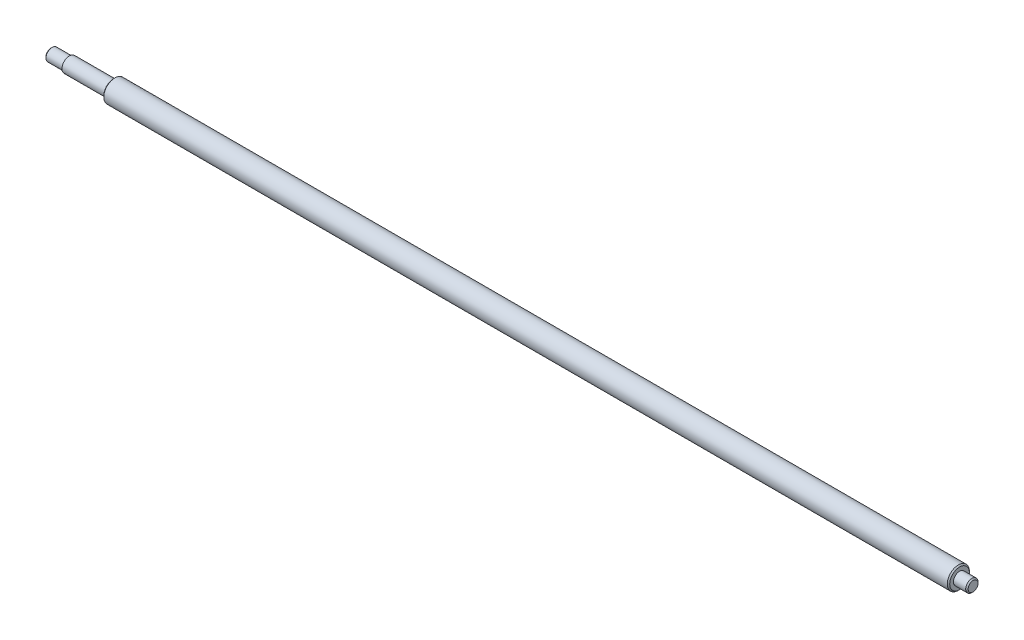
ISO-10303-21;
HEADER;
FILE_DESCRIPTION(('STEP AP214'),'2;1');
FILE_NAME('part.step','',(''),(''),'','','');
FILE_SCHEMA(('AUTOMOTIVE_DESIGN { 1 0 10303 214 1 1 1 1 }'));
ENDSEC;
DATA;
#1=APPLICATION_CONTEXT('core data for automotive mechanical design processes');
#2=APPLICATION_PROTOCOL_DEFINITION('international standard','automotive_design',2000,#1);
#3=PRODUCT_CONTEXT('',#1,'mechanical');
#4=PRODUCT('Part','Part','',(#3));
#5=PRODUCT_RELATED_PRODUCT_CATEGORY('part','',(#4));
#6=PRODUCT_DEFINITION_FORMATION('','',#4);
#7=PRODUCT_DEFINITION_CONTEXT('part definition',#1,'design');
#8=PRODUCT_DEFINITION('design','',#6,#7);
#9=PRODUCT_DEFINITION_SHAPE('','',#8);
#10=(LENGTH_UNIT() NAMED_UNIT(*) SI_UNIT(.MILLI.,.METRE.));
#11=(NAMED_UNIT(*) PLANE_ANGLE_UNIT() SI_UNIT($,.RADIAN.));
#12=(NAMED_UNIT(*) SI_UNIT($,.STERADIAN.) SOLID_ANGLE_UNIT());
#13=UNCERTAINTY_MEASURE_WITH_UNIT(LENGTH_MEASURE(1.E-05),#10,'distance_accuracy_value','');
#14=(GEOMETRIC_REPRESENTATION_CONTEXT(3) GLOBAL_UNCERTAINTY_ASSIGNED_CONTEXT((#13)) GLOBAL_UNIT_ASSIGNED_CONTEXT((#10,
#11,#12)) REPRESENTATION_CONTEXT('',''));
#15=CARTESIAN_POINT('',(0.,0.,0.));
#16=DIRECTION('',(0.,0.,1.));
#17=DIRECTION('',(1.,0.,0.));
#18=AXIS2_PLACEMENT_3D('',#15,#16,#17);
#19=CARTESIAN_POINT('',(-208.466913464529,0.,0.));
#20=DIRECTION('',(1.,0.,0.));
#21=DIRECTION('',(0.,0.,-1.));
#22=AXIS2_PLACEMENT_3D('',#19,#20,#21);
#23=PLANE('',#22);
#24=CARTESIAN_POINT('',(-208.466913464529,0.,0.));
#25=DIRECTION('',(-1.,0.,0.));
#26=DIRECTION('',(0.,0.,1.));
#27=AXIS2_PLACEMENT_3D('',#24,#25,#26);
#28=CIRCLE('',#27,4.);
#29=CARTESIAN_POINT('',(-208.466913464529,0.,4.));
#30=VERTEX_POINT('',#29);
#31=EDGE_CURVE('E10',#30,#30,#28,.T.);
#32=ORIENTED_EDGE('',*,*,#31,.T.);
#33=EDGE_LOOP('',(#32));
#34=FACE_BOUND('',#33,.T.);
#35=ADVANCED_FACE('F30',(#34),#23,.F.);
#36=CARTESIAN_POINT('',(-207.466913464529,0.,0.));
#37=DIRECTION('',(1.,0.,0.));
#38=DIRECTION('',(0.,0.,-1.));
#39=AXIS2_PLACEMENT_3D('',#36,#37,#38);
#40=CONICAL_SURFACE('',#39,5.,0.785398163397448);
#41=ORIENTED_EDGE('',*,*,#31,.F.);
#42=EDGE_LOOP('',(#41));
#43=FACE_BOUND('',#42,.T.);
#44=CARTESIAN_POINT('',(-207.466913464529,0.,0.));
#45=DIRECTION('',(-1.,0.,0.));
#46=DIRECTION('',(0.,0.,1.));
#47=AXIS2_PLACEMENT_3D('',#44,#45,#46);
#48=CIRCLE('',#47,5.);
#49=CARTESIAN_POINT('',(-207.466913464529,0.,5.));
#50=VERTEX_POINT('',#49);
#51=EDGE_CURVE('E36',#50,#50,#48,.T.);
#52=ORIENTED_EDGE('',*,*,#51,.T.);
#53=EDGE_LOOP('',(#52));
#54=FACE_BOUND('',#53,.T.);
#55=ADVANCED_FACE('F86',(#43,#54),#40,.T.);
#56=CARTESIAN_POINT('',(-222.964145739585,0.,0.));
#57=DIRECTION('',(-1.,0.,0.));
#58=DIRECTION('',(0.,0.,1.));
#59=AXIS2_PLACEMENT_3D('',#56,#57,#58);
#60=CYLINDRICAL_SURFACE('',#59,5.);
#61=ORIENTED_EDGE('',*,*,#51,.F.);
#62=EDGE_LOOP('',(#61));
#63=FACE_BOUND('',#62,.T.);
#64=CARTESIAN_POINT('',(-193.466913464529,0.,0.));
#65=DIRECTION('',(-1.,0.,0.));
#66=DIRECTION('',(0.,0.,1.));
#67=AXIS2_PLACEMENT_3D('',#64,#65,#66);
#68=CIRCLE('',#67,5.);
#69=CARTESIAN_POINT('',(-193.466913464529,0.,5.));
#70=VERTEX_POINT('',#69);
#71=EDGE_CURVE('E40',#70,#70,#68,.T.);
#72=ORIENTED_EDGE('',*,*,#71,.T.);
#73=EDGE_LOOP('',(#72));
#74=FACE_BOUND('',#73,.T.);
#75=ADVANCED_FACE('F90',(#63,#74),#60,.T.);
#76=CARTESIAN_POINT('',(-193.466913464529,0.,-5.));
#77=DIRECTION('',(1.,0.,0.));
#78=DIRECTION('',(0.,0.,-1.));
#79=AXIS2_PLACEMENT_3D('',#76,#77,#78);
#80=PLANE('',#79);
#81=ORIENTED_EDGE('',*,*,#71,.F.);
#82=EDGE_LOOP('',(#81));
#83=FACE_BOUND('',#82,.T.);
#84=CARTESIAN_POINT('',(-193.466913464529,0.,0.));
#85=DIRECTION('',(-1.,0.,0.));
#86=DIRECTION('',(0.,0.,1.));
#87=AXIS2_PLACEMENT_3D('',#84,#85,#86);
#88=CIRCLE('',#87,6.);
#89=CARTESIAN_POINT('',(-193.466913464529,0.,6.));
#90=VERTEX_POINT('',#89);
#91=EDGE_CURVE('E44',#90,#90,#88,.T.);
#92=ORIENTED_EDGE('',*,*,#91,.T.);
#93=EDGE_LOOP('',(#92));
#94=FACE_BOUND('',#93,.T.);
#95=ADVANCED_FACE('F95',(#83,#94),#80,.F.);
#96=CARTESIAN_POINT('',(-222.964145739585,0.,0.));
#97=DIRECTION('',(-1.,0.,0.));
#98=DIRECTION('',(0.,0.,1.));
#99=AXIS2_PLACEMENT_3D('',#96,#97,#98);
#100=CYLINDRICAL_SURFACE('',#99,6.);
#101=ORIENTED_EDGE('',*,*,#91,.F.);
#102=EDGE_LOOP('',(#101));
#103=FACE_BOUND('',#102,.T.);
#104=CARTESIAN_POINT('',(-157.466913464529,0.,0.));
#105=DIRECTION('',(-1.,0.,0.));
#106=DIRECTION('',(0.,0.,1.));
#107=AXIS2_PLACEMENT_3D('',#104,#105,#106);
#108=CIRCLE('',#107,6.);
#109=CARTESIAN_POINT('',(-157.466913464529,0.,6.));
#110=VERTEX_POINT('',#109);
#111=EDGE_CURVE('E49',#110,#110,#108,.T.);
#112=ORIENTED_EDGE('',*,*,#111,.T.);
#113=EDGE_LOOP('',(#112));
#114=FACE_BOUND('',#113,.T.);
#115=ADVANCED_FACE('F101',(#103,#114),#100,.T.);
#116=CARTESIAN_POINT('',(-157.466913464529,0.,-6.));
#117=DIRECTION('',(1.,0.,0.));
#118=DIRECTION('',(0.,0.,-1.));
#119=AXIS2_PLACEMENT_3D('',#116,#117,#118);
#120=PLANE('',#119);
#121=ORIENTED_EDGE('',*,*,#111,.F.);
#122=EDGE_LOOP('',(#121));
#123=FACE_BOUND('',#122,.T.);
#124=CARTESIAN_POINT('',(-157.466913464529,0.,0.));
#125=DIRECTION('',(-1.,0.,0.));
#126=DIRECTION('',(0.,0.,1.));
#127=AXIS2_PLACEMENT_3D('',#124,#125,#126);
#128=CIRCLE('',#127,8.);
#129=CARTESIAN_POINT('',(-157.466913464529,0.,8.));
#130=VERTEX_POINT('',#129);
#131=EDGE_CURVE('E52',#130,#130,#128,.T.);
#132=ORIENTED_EDGE('',*,*,#131,.T.);
#133=EDGE_LOOP('',(#132));
#134=FACE_BOUND('',#133,.T.);
#135=ADVANCED_FACE('F105',(#123,#134),#120,.F.);
#136=CARTESIAN_POINT('',(-156.466913464529,0.,0.));
#137=DIRECTION('',(1.,0.,0.));
#138=DIRECTION('',(0.,0.,-1.));
#139=AXIS2_PLACEMENT_3D('',#136,#137,#138);
#140=CONICAL_SURFACE('',#139,9.,0.785398163397447);
#141=ORIENTED_EDGE('',*,*,#131,.F.);
#142=EDGE_LOOP('',(#141));
#143=FACE_BOUND('',#142,.T.);
#144=CARTESIAN_POINT('',(-156.466913464529,0.,0.));
#145=DIRECTION('',(-1.,0.,0.));
#146=DIRECTION('',(0.,0.,1.));
#147=AXIS2_PLACEMENT_3D('',#144,#145,#146);
#148=CIRCLE('',#147,9.);
#149=CARTESIAN_POINT('',(-156.466913464529,0.,9.));
#150=VERTEX_POINT('',#149);
#151=EDGE_CURVE('E55',#150,#150,#148,.T.);
#152=ORIENTED_EDGE('',*,*,#151,.T.);
#153=EDGE_LOOP('',(#152));
#154=FACE_BOUND('',#153,.T.);
#155=ADVANCED_FACE('F109',(#143,#154),#140,.T.);
#156=CARTESIAN_POINT('',(-222.964145739585,0.,0.));
#157=DIRECTION('',(-1.,0.,0.));
#158=DIRECTION('',(0.,0.,1.));
#159=AXIS2_PLACEMENT_3D('',#156,#157,#158);
#160=CYLINDRICAL_SURFACE('',#159,9.);
#161=ORIENTED_EDGE('',*,*,#151,.F.);
#162=EDGE_LOOP('',(#161));
#163=FACE_BOUND('',#162,.T.);
#164=CARTESIAN_POINT('',(529.533086535471,0.,0.));
#165=DIRECTION('',(-1.,0.,0.));
#166=DIRECTION('',(0.,0.,1.));
#167=AXIS2_PLACEMENT_3D('',#164,#165,#166);
#168=CIRCLE('',#167,9.);
#169=CARTESIAN_POINT('',(529.533086535471,0.,9.));
#170=VERTEX_POINT('',#169);
#171=EDGE_CURVE('E58',#170,#170,#168,.T.);
#172=ORIENTED_EDGE('',*,*,#171,.T.);
#173=EDGE_LOOP('',(#172));
#174=FACE_BOUND('',#173,.T.);
#175=ADVANCED_FACE('F113',(#163,#174),#160,.T.);
#176=CARTESIAN_POINT('',(530.533086535471,0.,0.));
#177=DIRECTION('',(-1.,0.,0.));
#178=DIRECTION('',(0.,0.,1.));
#179=AXIS2_PLACEMENT_3D('',#176,#177,#178);
#180=CONICAL_SURFACE('',#179,8.,0.785398163397392);
#181=ORIENTED_EDGE('',*,*,#171,.F.);
#182=EDGE_LOOP('',(#181));
#183=FACE_BOUND('',#182,.T.);
#184=CARTESIAN_POINT('',(530.533086535471,0.,0.));
#185=DIRECTION('',(-1.,0.,0.));
#186=DIRECTION('',(0.,0.,1.));
#187=AXIS2_PLACEMENT_3D('',#184,#185,#186);
#188=CIRCLE('',#187,8.);
#189=CARTESIAN_POINT('',(530.533086535471,0.,8.));
#190=VERTEX_POINT('',#189);
#191=EDGE_CURVE('E61',#190,#190,#188,.T.);
#192=ORIENTED_EDGE('',*,*,#191,.T.);
#193=EDGE_LOOP('',(#192));
#194=FACE_BOUND('',#193,.T.);
#195=ADVANCED_FACE('F117',(#183,#194),#180,.T.);
#196=CARTESIAN_POINT('',(530.533086535471,0.,-8.));
#197=DIRECTION('',(-1.,0.,0.));
#198=DIRECTION('',(0.,0.,1.));
#199=AXIS2_PLACEMENT_3D('',#196,#197,#198);
#200=PLANE('',#199);
#201=ORIENTED_EDGE('',*,*,#191,.F.);
#202=EDGE_LOOP('',(#201));
#203=FACE_BOUND('',#202,.T.);
#204=CARTESIAN_POINT('',(530.533086535471,0.,0.));
#205=DIRECTION('',(-1.,0.,0.));
#206=DIRECTION('',(0.,0.,1.));
#207=AXIS2_PLACEMENT_3D('',#204,#205,#206);
#208=CIRCLE('',#207,5.);
#209=CARTESIAN_POINT('',(530.533086535471,0.,5.));
#210=VERTEX_POINT('',#209);
#211=EDGE_CURVE('E64',#210,#210,#208,.T.);
#212=ORIENTED_EDGE('',*,*,#211,.T.);
#213=EDGE_LOOP('',(#212));
#214=FACE_BOUND('',#213,.T.);
#215=ADVANCED_FACE('F121',(#203,#214),#200,.F.);
#216=CARTESIAN_POINT('',(-222.964145739585,0.,0.));
#217=DIRECTION('',(-1.,0.,0.));
#218=DIRECTION('',(0.,0.,1.));
#219=AXIS2_PLACEMENT_3D('',#216,#217,#218);
#220=CYLINDRICAL_SURFACE('',#219,5.);
#221=ORIENTED_EDGE('',*,*,#211,.F.);
#222=EDGE_LOOP('',(#221));
#223=FACE_BOUND('',#222,.T.);
#224=CARTESIAN_POINT('',(540.533086535471,0.,0.));
#225=DIRECTION('',(-1.,0.,0.));
#226=DIRECTION('',(0.,0.,1.));
#227=AXIS2_PLACEMENT_3D('',#224,#225,#226);
#228=CIRCLE('',#227,5.);
#229=CARTESIAN_POINT('',(540.533086535471,0.,5.));
#230=VERTEX_POINT('',#229);
#231=EDGE_CURVE('E67',#230,#230,#228,.T.);
#232=ORIENTED_EDGE('',*,*,#231,.T.);
#233=EDGE_LOOP('',(#232));
#234=FACE_BOUND('',#233,.T.);
#235=ADVANCED_FACE('F82',(#223,#234),#220,.T.);
#236=CARTESIAN_POINT('',(541.533086535471,0.,0.));
#237=DIRECTION('',(-1.,0.,0.));
#238=DIRECTION('',(0.,0.,1.));
#239=AXIS2_PLACEMENT_3D('',#236,#237,#238);
#240=CONICAL_SURFACE('',#239,4.,0.785398163397448);
#241=ORIENTED_EDGE('',*,*,#231,.F.);
#242=EDGE_LOOP('',(#241));
#243=FACE_BOUND('',#242,.T.);
#244=CARTESIAN_POINT('',(541.533086535471,0.,0.));
#245=DIRECTION('',(-1.,0.,0.));
#246=DIRECTION('',(0.,0.,1.));
#247=AXIS2_PLACEMENT_3D('',#244,#245,#246);
#248=CIRCLE('',#247,4.);
#249=CARTESIAN_POINT('',(541.533086535471,0.,4.));
#250=VERTEX_POINT('',#249);
#251=EDGE_CURVE('E70',#250,#250,#248,.T.);
#252=ORIENTED_EDGE('',*,*,#251,.T.);
#253=EDGE_LOOP('',(#252));
#254=FACE_BOUND('',#253,.T.);
#255=ADVANCED_FACE('F74',(#243,#254),#240,.T.);
#256=CARTESIAN_POINT('',(541.533086535471,0.,-4.));
#257=DIRECTION('',(-1.,0.,0.));
#258=DIRECTION('',(0.,0.,1.));
#259=AXIS2_PLACEMENT_3D('',#256,#257,#258);
#260=PLANE('',#259);
#261=ORIENTED_EDGE('',*,*,#251,.F.);
#262=EDGE_LOOP('',(#261));
#263=FACE_BOUND('',#262,.T.);
#264=ADVANCED_FACE('F76',(#263),#260,.F.);
#265=CLOSED_SHELL('',(#35,#55,#75,#95,#115,#135,#155,#175,#195,#215,#235,#255,#264));
#266=MANIFOLD_SOLID_BREP('B2',#265);
#267=ADVANCED_BREP_SHAPE_REPRESENTATION('',(#18,#266),#14);
#268=SHAPE_DEFINITION_REPRESENTATION(#9,#267);
ENDSEC;
END-ISO-10303-21;
